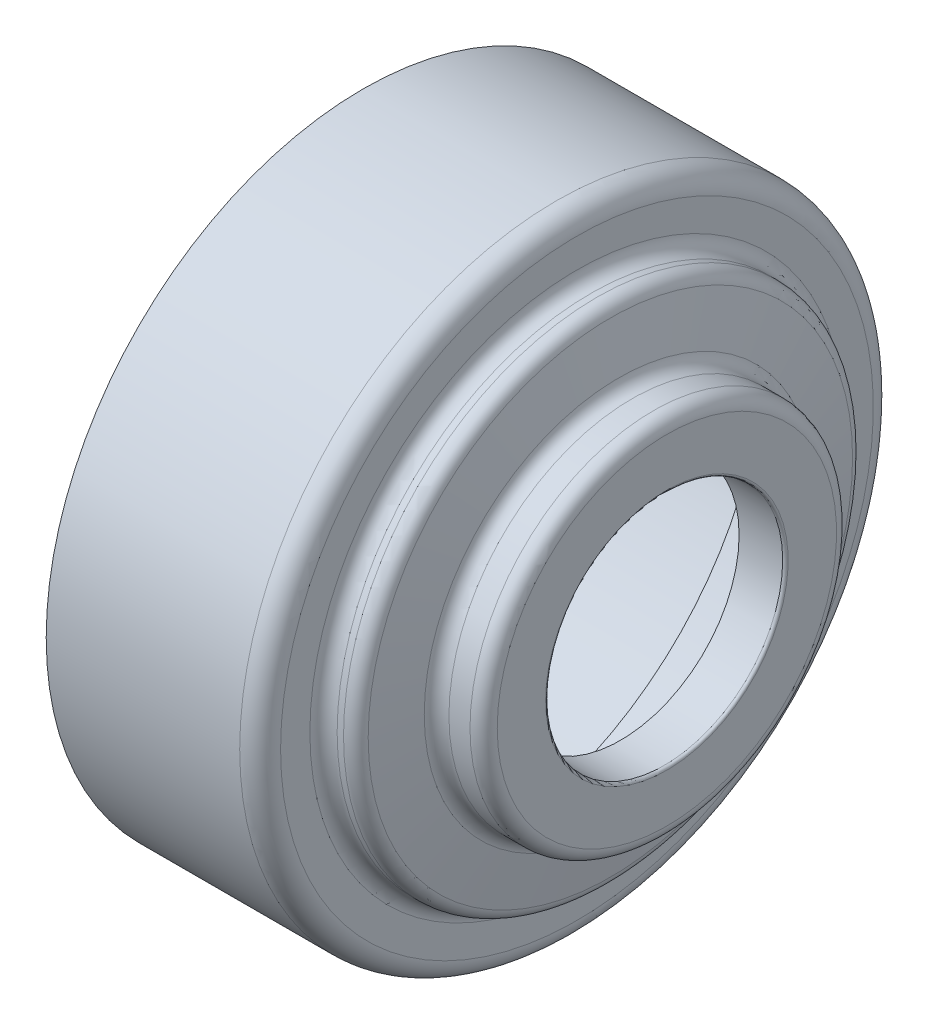
ISO-10303-21;
HEADER;
FILE_DESCRIPTION(('STEP AP214'),'2;1');
FILE_NAME('part.step','',(''),(''),'','','');
FILE_SCHEMA(('AUTOMOTIVE_DESIGN { 1 0 10303 214 1 1 1 1 }'));
ENDSEC;
DATA;
#1=APPLICATION_CONTEXT('core data for automotive mechanical design processes');
#2=APPLICATION_PROTOCOL_DEFINITION('international standard','automotive_design',2000,#1);
#3=PRODUCT_CONTEXT('',#1,'mechanical');
#4=PRODUCT('Part','Part','',(#3));
#5=PRODUCT_RELATED_PRODUCT_CATEGORY('part','',(#4));
#6=PRODUCT_DEFINITION_FORMATION('','',#4);
#7=PRODUCT_DEFINITION_CONTEXT('part definition',#1,'design');
#8=PRODUCT_DEFINITION('design','',#6,#7);
#9=PRODUCT_DEFINITION_SHAPE('','',#8);
#10=(LENGTH_UNIT() NAMED_UNIT(*) SI_UNIT(.MILLI.,.METRE.));
#11=(NAMED_UNIT(*) PLANE_ANGLE_UNIT() SI_UNIT($,.RADIAN.));
#12=(NAMED_UNIT(*) SI_UNIT($,.STERADIAN.) SOLID_ANGLE_UNIT());
#13=UNCERTAINTY_MEASURE_WITH_UNIT(LENGTH_MEASURE(1.E-05),#10,'distance_accuracy_value','');
#14=(GEOMETRIC_REPRESENTATION_CONTEXT(3) GLOBAL_UNCERTAINTY_ASSIGNED_CONTEXT((#13)) GLOBAL_UNIT_ASSIGNED_CONTEXT((#10,
#11,#12)) REPRESENTATION_CONTEXT('',''));
#15=CARTESIAN_POINT('',(0.,0.,0.));
#16=DIRECTION('',(0.,0.,1.));
#17=DIRECTION('',(1.,0.,0.));
#18=AXIS2_PLACEMENT_3D('',#15,#16,#17);
#19=CARTESIAN_POINT('',(-14.5,22.,0.));
#20=DIRECTION('',(1.,0.,0.));
#21=DIRECTION('',(0.,0.,-1.));
#22=AXIS2_PLACEMENT_3D('',#19,#20,#21);
#23=PLANE('',#22);
#24=CARTESIAN_POINT('',(-14.5,0.,0.));
#25=DIRECTION('',(-1.,0.,0.));
#26=DIRECTION('',(0.,0.,1.));
#27=AXIS2_PLACEMENT_3D('',#24,#25,#26);
#28=CIRCLE('',#27,22.);
#29=CARTESIAN_POINT('',(-14.5,0.,22.));
#30=VERTEX_POINT('',#29);
#31=EDGE_CURVE('E127',#30,#30,#28,.T.);
#32=ORIENTED_EDGE('',*,*,#31,.F.);
#33=EDGE_LOOP('',(#32));
#34=FACE_BOUND('',#33,.T.);
#35=CARTESIAN_POINT('',(-14.5,0.,0.));
#36=DIRECTION('',(-1.,0.,0.));
#37=DIRECTION('',(0.,0.,1.));
#38=AXIS2_PLACEMENT_3D('',#35,#36,#37);
#39=CIRCLE('',#38,23.25);
#40=CARTESIAN_POINT('',(-14.5,0.,23.25));
#41=VERTEX_POINT('',#40);
#42=EDGE_CURVE('E109',#41,#41,#39,.T.);
#43=ORIENTED_EDGE('',*,*,#42,.T.);
#44=EDGE_LOOP('',(#43));
#45=FACE_BOUND('',#44,.T.);
#46=ADVANCED_FACE('F35',(#34,#45),#23,.F.);
#47=CARTESIAN_POINT('',(-36.9366053169734,0.,0.));
#48=DIRECTION('',(-1.,0.,0.));
#49=DIRECTION('',(0.,0.,1.));
#50=AXIS2_PLACEMENT_3D('',#47,#48,#49);
#51=CYLINDRICAL_SURFACE('',#50,23.25);
#52=CARTESIAN_POINT('',(-0.300000000000002,0.,0.));
#53=DIRECTION('',(-1.,0.,0.));
#54=DIRECTION('',(0.,0.,1.));
#55=AXIS2_PLACEMENT_3D('',#52,#53,#54);
#56=CIRCLE('',#55,23.25);
#57=CARTESIAN_POINT('',(-0.300000000000002,0.,23.25));
#58=VERTEX_POINT('',#57);
#59=EDGE_CURVE('E50',#58,#58,#56,.T.);
#60=ORIENTED_EDGE('',*,*,#59,.T.);
#61=EDGE_LOOP('',(#60));
#62=FACE_BOUND('',#61,.T.);
#63=ORIENTED_EDGE('',*,*,#42,.F.);
#64=EDGE_LOOP('',(#63));
#65=FACE_BOUND('',#64,.T.);
#66=ADVANCED_FACE('F135',(#62,#65),#51,.T.);
#67=CARTESIAN_POINT('',(1.2,23.25,0.));
#68=DIRECTION('',(-1.,0.,0.));
#69=DIRECTION('',(0.,0.,1.));
#70=AXIS2_PLACEMENT_3D('',#67,#68,#69);
#71=PLANE('',#70);
#72=CARTESIAN_POINT('',(1.2,0.,0.));
#73=DIRECTION('',(-1.,0.,0.));
#74=DIRECTION('',(0.,0.,1.));
#75=AXIS2_PLACEMENT_3D('',#72,#73,#74);
#76=CIRCLE('',#75,21.75);
#77=CARTESIAN_POINT('',(1.2,0.,21.75));
#78=VERTEX_POINT('',#77);
#79=EDGE_CURVE('E46',#78,#78,#76,.F.);
#80=ORIENTED_EDGE('',*,*,#79,.T.);
#81=EDGE_LOOP('',(#80));
#82=FACE_BOUND('',#81,.T.);
#83=CARTESIAN_POINT('',(1.2,0.,0.));
#84=DIRECTION('',(-1.,0.,0.));
#85=DIRECTION('',(0.,0.,1.));
#86=AXIS2_PLACEMENT_3D('',#83,#84,#85);
#87=CIRCLE('',#86,19.6);
#88=CARTESIAN_POINT('',(1.2,0.,19.6));
#89=VERTEX_POINT('',#88);
#90=EDGE_CURVE('E67',#89,#89,#87,.T.);
#91=ORIENTED_EDGE('',*,*,#90,.T.);
#92=EDGE_LOOP('',(#91));
#93=FACE_BOUND('',#92,.T.);
#94=ADVANCED_FACE('F140',(#82,#93),#71,.F.);
#95=CARTESIAN_POINT('',(-36.9366053169734,0.,0.));
#96=DIRECTION('',(-1.,0.,0.));
#97=DIRECTION('',(0.,0.,1.));
#98=AXIS2_PLACEMENT_3D('',#95,#96,#97);
#99=CYLINDRICAL_SURFACE('',#98,18.6);
#100=CARTESIAN_POINT('',(2.2,0.,0.));
#101=DIRECTION('',(-1.,0.,0.));
#102=DIRECTION('',(0.,0.,1.));
#103=AXIS2_PLACEMENT_3D('',#100,#101,#102);
#104=CIRCLE('',#103,18.6);
#105=CARTESIAN_POINT('',(2.2,0.,18.6));
#106=VERTEX_POINT('',#105);
#107=EDGE_CURVE('E61',#106,#106,#104,.F.);
#108=ORIENTED_EDGE('',*,*,#107,.T.);
#109=EDGE_LOOP('',(#108));
#110=FACE_BOUND('',#109,.T.);
#111=CARTESIAN_POINT('',(2.66781992623546,0.,0.));
#112=DIRECTION('',(1.,0.,0.));
#113=DIRECTION('',(0.,0.,-1.));
#114=AXIS2_PLACEMENT_3D('',#111,#112,#113);
#115=CIRCLE('',#114,18.6);
#116=CARTESIAN_POINT('',(2.66781992623546,0.,-18.6));
#117=VERTEX_POINT('',#116);
#118=EDGE_CURVE('E64',#117,#117,#115,.F.);
#119=ORIENTED_EDGE('',*,*,#118,.T.);
#120=EDGE_LOOP('',(#119));
#121=FACE_BOUND('',#120,.T.);
#122=ADVANCED_FACE('F146',(#110,#121),#99,.T.);
#123=CARTESIAN_POINT('',(4.41500350806134,0.,0.));
#124=DIRECTION('',(-1.,0.,0.));
#125=DIRECTION('',(0.,0.,1.));
#126=AXIS2_PLACEMENT_3D('',#123,#124,#125);
#127=CONICAL_SURFACE('',#126,13.45,1.39626340159546);
#128=CARTESIAN_POINT('',(3.65262767924767,0.,0.));
#129=DIRECTION('',(1.,0.,0.));
#130=DIRECTION('',(0.,0.,-1.));
#131=AXIS2_PLACEMENT_3D('',#128,#129,#130);
#132=CIRCLE('',#131,17.7736481776669);
#133=CARTESIAN_POINT('',(3.65262767924767,0.,-17.7736481776669));
#134=VERTEX_POINT('',#133);
#135=EDGE_CURVE('E55',#134,#134,#132,.T.);
#136=ORIENTED_EDGE('',*,*,#135,.T.);
#137=EDGE_LOOP('',(#136));
#138=FACE_BOUND('',#137,.T.);
#139=CARTESIAN_POINT('',(4.26929538622642,0.,0.));
#140=DIRECTION('',(-1.,0.,0.));
#141=DIRECTION('',(0.,0.,1.));
#142=AXIS2_PLACEMENT_3D('',#139,#140,#141);
#143=CIRCLE('',#142,14.2763518223331);
#144=CARTESIAN_POINT('',(4.26929538622642,0.,14.2763518223331));
#145=VERTEX_POINT('',#144);
#146=EDGE_CURVE('E58',#145,#145,#143,.T.);
#147=ORIENTED_EDGE('',*,*,#146,.T.);
#148=EDGE_LOOP('',(#147));
#149=FACE_BOUND('',#148,.T.);
#150=ADVANCED_FACE('F291',(#138,#149),#127,.T.);
#151=CARTESIAN_POINT('',(-36.9366053169734,0.,0.));
#152=DIRECTION('',(-1.,0.,0.));
#153=DIRECTION('',(0.,0.,1.));
#154=AXIS2_PLACEMENT_3D('',#151,#152,#153);
#155=CYLINDRICAL_SURFACE('',#154,13.45);
#156=CARTESIAN_POINT('',(6.8,0.,0.));
#157=DIRECTION('',(-1.,0.,0.));
#158=DIRECTION('',(0.,0.,1.));
#159=AXIS2_PLACEMENT_3D('',#156,#157,#158);
#160=CIRCLE('',#159,13.45);
#161=CARTESIAN_POINT('',(6.8,0.,13.45));
#162=VERTEX_POINT('',#161);
#163=EDGE_CURVE('E73',#162,#162,#160,.T.);
#164=ORIENTED_EDGE('',*,*,#163,.T.);
#165=EDGE_LOOP('',(#164));
#166=FACE_BOUND('',#165,.T.);
#167=CARTESIAN_POINT('',(5.25410313923862,0.,0.));
#168=DIRECTION('',(-1.,0.,0.));
#169=DIRECTION('',(0.,0.,1.));
#170=AXIS2_PLACEMENT_3D('',#167,#168,#169);
#171=CIRCLE('',#170,13.45);
#172=CARTESIAN_POINT('',(5.25410313923862,0.,13.45));
#173=VERTEX_POINT('',#172);
#174=EDGE_CURVE('E76',#173,#173,#171,.F.);
#175=ORIENTED_EDGE('',*,*,#174,.T.);
#176=EDGE_LOOP('',(#175));
#177=FACE_BOUND('',#176,.T.);
#178=ADVANCED_FACE('F279',(#166,#177),#155,.T.);
#179=CARTESIAN_POINT('',(7.8,13.45,0.));
#180=DIRECTION('',(-1.,0.,0.));
#181=DIRECTION('',(0.,0.,1.));
#182=AXIS2_PLACEMENT_3D('',#179,#180,#181);
#183=PLANE('',#182);
#184=CARTESIAN_POINT('',(7.8,0.,0.));
#185=DIRECTION('',(-1.,0.,0.));
#186=DIRECTION('',(0.,0.,1.));
#187=AXIS2_PLACEMENT_3D('',#184,#185,#186);
#188=CIRCLE('',#187,12.45);
#189=CARTESIAN_POINT('',(7.8,0.,12.45));
#190=VERTEX_POINT('',#189);
#191=EDGE_CURVE('E70',#190,#190,#188,.F.);
#192=ORIENTED_EDGE('',*,*,#191,.T.);
#193=EDGE_LOOP('',(#192));
#194=FACE_BOUND('',#193,.T.);
#195=CARTESIAN_POINT('',(7.8,0.,0.));
#196=DIRECTION('',(-1.,0.,0.));
#197=DIRECTION('',(0.,0.,1.));
#198=AXIS2_PLACEMENT_3D('',#195,#196,#197);
#199=CIRCLE('',#198,8.9);
#200=CARTESIAN_POINT('',(7.8,0.,8.9));
#201=VERTEX_POINT('',#200);
#202=EDGE_CURVE('E100',#201,#201,#199,.T.);
#203=ORIENTED_EDGE('',*,*,#202,.T.);
#204=EDGE_LOOP('',(#203));
#205=FACE_BOUND('',#204,.T.);
#206=ADVANCED_FACE('F273',(#194,#205),#183,.F.);
#207=CARTESIAN_POINT('',(-36.9366053169734,0.,0.));
#208=DIRECTION('',(-1.,0.,0.));
#209=DIRECTION('',(0.,0.,1.));
#210=AXIS2_PLACEMENT_3D('',#207,#208,#209);
#211=CYLINDRICAL_SURFACE('',#210,8.7);
#212=CARTESIAN_POINT('',(7.6,0.,0.));
#213=DIRECTION('',(-1.,0.,0.));
#214=DIRECTION('',(0.,0.,1.));
#215=AXIS2_PLACEMENT_3D('',#212,#213,#214);
#216=CIRCLE('',#215,8.7);
#217=CARTESIAN_POINT('',(7.6,0.,8.7));
#218=VERTEX_POINT('',#217);
#219=EDGE_CURVE('E97',#218,#218,#216,.F.);
#220=ORIENTED_EDGE('',*,*,#219,.T.);
#221=EDGE_LOOP('',(#220));
#222=FACE_BOUND('',#221,.T.);
#223=CARTESIAN_POINT('',(4.4,0.,0.));
#224=DIRECTION('',(-1.,0.,0.));
#225=DIRECTION('',(0.,0.,1.));
#226=AXIS2_PLACEMENT_3D('',#223,#224,#225);
#227=CIRCLE('',#226,8.7);
#228=CARTESIAN_POINT('',(4.4,0.,8.7));
#229=VERTEX_POINT('',#228);
#230=EDGE_CURVE('E112',#229,#229,#227,.T.);
#231=ORIENTED_EDGE('',*,*,#230,.T.);
#232=EDGE_LOOP('',(#231));
#233=FACE_BOUND('',#232,.T.);
#234=ADVANCED_FACE('F278',(#222,#233),#211,.F.);
#235=CARTESIAN_POINT('',(4.4,9.4,0.));
#236=DIRECTION('',(1.,0.,0.));
#237=DIRECTION('',(0.,0.,-1.));
#238=AXIS2_PLACEMENT_3D('',#235,#236,#237);
#239=PLANE('',#238);
#240=ORIENTED_EDGE('',*,*,#230,.F.);
#241=EDGE_LOOP('',(#240));
#242=FACE_BOUND('',#241,.T.);
#243=CARTESIAN_POINT('',(4.4,0.,0.));
#244=DIRECTION('',(-1.,0.,0.));
#245=DIRECTION('',(0.,0.,1.));
#246=AXIS2_PLACEMENT_3D('',#243,#244,#245);
#247=CIRCLE('',#246,9.4);
#248=CARTESIAN_POINT('',(4.4,0.,9.4));
#249=VERTEX_POINT('',#248);
#250=EDGE_CURVE('E115',#249,#249,#247,.T.);
#251=ORIENTED_EDGE('',*,*,#250,.T.);
#252=EDGE_LOOP('',(#251));
#253=FACE_BOUND('',#252,.T.);
#254=ADVANCED_FACE('F385',(#242,#253),#239,.F.);
#255=CARTESIAN_POINT('',(-36.9366053169734,0.,0.));
#256=DIRECTION('',(-1.,0.,0.));
#257=DIRECTION('',(0.,0.,1.));
#258=AXIS2_PLACEMENT_3D('',#255,#256,#257);
#259=CYLINDRICAL_SURFACE('',#258,9.4);
#260=ORIENTED_EDGE('',*,*,#250,.F.);
#261=EDGE_LOOP('',(#260));
#262=FACE_BOUND('',#261,.T.);
#263=CARTESIAN_POINT('',(6.6,0.,0.));
#264=DIRECTION('',(-1.,0.,0.));
#265=DIRECTION('',(0.,0.,1.));
#266=AXIS2_PLACEMENT_3D('',#263,#264,#265);
#267=CIRCLE('',#266,9.4);
#268=CARTESIAN_POINT('',(6.6,0.,9.4));
#269=VERTEX_POINT('',#268);
#270=EDGE_CURVE('E118',#269,#269,#267,.T.);
#271=ORIENTED_EDGE('',*,*,#270,.T.);
#272=EDGE_LOOP('',(#271));
#273=FACE_BOUND('',#272,.T.);
#274=ADVANCED_FACE('F375',(#262,#273),#259,.T.);
#275=CARTESIAN_POINT('',(6.6,12.25,0.));
#276=DIRECTION('',(1.,0.,0.));
#277=DIRECTION('',(0.,0.,-1.));
#278=AXIS2_PLACEMENT_3D('',#275,#276,#277);
#279=PLANE('',#278);
#280=CARTESIAN_POINT('',(6.6,0.,0.));
#281=DIRECTION('',(1.,0.,0.));
#282=DIRECTION('',(0.,0.,-1.));
#283=AXIS2_PLACEMENT_3D('',#280,#281,#282);
#284=CIRCLE('',#283,12.05);
#285=CARTESIAN_POINT('',(6.6,0.,-12.05));
#286=VERTEX_POINT('',#285);
#287=EDGE_CURVE('E106',#286,#286,#284,.F.);
#288=ORIENTED_EDGE('',*,*,#287,.T.);
#289=EDGE_LOOP('',(#288));
#290=FACE_BOUND('',#289,.T.);
#291=ORIENTED_EDGE('',*,*,#270,.F.);
#292=EDGE_LOOP('',(#291));
#293=FACE_BOUND('',#292,.T.);
#294=ADVANCED_FACE('F229',(#290,#293),#279,.F.);
#295=CARTESIAN_POINT('',(-36.9366053169734,0.,0.));
#296=DIRECTION('',(-1.,0.,0.));
#297=DIRECTION('',(0.,0.,1.));
#298=AXIS2_PLACEMENT_3D('',#295,#296,#297);
#299=CYLINDRICAL_SURFACE('',#298,12.25);
#300=CARTESIAN_POINT('',(4.66673339741452,0.,0.));
#301=DIRECTION('',(1.,0.,0.));
#302=DIRECTION('',(0.,0.,-1.));
#303=AXIS2_PLACEMENT_3D('',#300,#301,#302);
#304=CIRCLE('',#303,12.25);
#305=CARTESIAN_POINT('',(4.66673339741452,0.,-12.25));
#306=VERTEX_POINT('',#305);
#307=EDGE_CURVE('E42',#306,#306,#304,.F.);
#308=ORIENTED_EDGE('',*,*,#307,.T.);
#309=EDGE_LOOP('',(#308));
#310=FACE_BOUND('',#309,.T.);
#311=CARTESIAN_POINT('',(6.4,0.,0.));
#312=DIRECTION('',(1.,0.,0.));
#313=DIRECTION('',(0.,0.,-1.));
#314=AXIS2_PLACEMENT_3D('',#311,#312,#313);
#315=CIRCLE('',#314,12.25);
#316=CARTESIAN_POINT('',(6.4,0.,-12.25));
#317=VERTEX_POINT('',#316);
#318=EDGE_CURVE('E103',#317,#317,#315,.T.);
#319=ORIENTED_EDGE('',*,*,#318,.T.);
#320=EDGE_LOOP('',(#319));
#321=FACE_BOUND('',#320,.T.);
#322=ADVANCED_FACE('F218',(#310,#321),#299,.F.);
#323=CARTESIAN_POINT('',(2.5,0.,0.));
#324=DIRECTION('',(-1.,0.,0.));
#325=DIRECTION('',(0.,0.,1.));
#326=AXIS2_PLACEMENT_3D('',#323,#324,#325);
#327=CONICAL_SURFACE('',#326,17.4,1.39626340159546);
#328=CARTESIAN_POINT('',(3.18952176789621,0.,0.));
#329=DIRECTION('',(1.,0.,0.));
#330=DIRECTION('',(0.,0.,-1.));
#331=AXIS2_PLACEMENT_3D('',#328,#329,#330);
#332=CIRCLE('',#331,13.4895277334996);
#333=CARTESIAN_POINT('',(3.18952176789621,0.,-13.4895277334996));
#334=VERTEX_POINT('',#333);
#335=EDGE_CURVE('E10',#334,#334,#332,.T.);
#336=ORIENTED_EDGE('',*,*,#335,.T.);
#337=EDGE_LOOP('',(#336));
#338=FACE_BOUND('',#337,.T.);
#339=CARTESIAN_POINT('',(2.529141624367,0.,0.));
#340=DIRECTION('',(-1.,0.,0.));
#341=DIRECTION('',(0.,0.,1.));
#342=AXIS2_PLACEMENT_3D('',#339,#340,#341);
#343=CIRCLE('',#342,17.2347296355334);
#344=CARTESIAN_POINT('',(2.529141624367,0.,17.2347296355334));
#345=VERTEX_POINT('',#344);
#346=EDGE_CURVE('E94',#345,#345,#343,.T.);
#347=ORIENTED_EDGE('',*,*,#346,.T.);
#348=EDGE_LOOP('',(#347));
#349=FACE_BOUND('',#348,.T.);
#350=ADVANCED_FACE('F212',(#338,#349),#327,.F.);
#351=CARTESIAN_POINT('',(-36.9366053169734,0.,0.));
#352=DIRECTION('',(-1.,0.,0.));
#353=DIRECTION('',(0.,0.,1.));
#354=AXIS2_PLACEMENT_3D('',#351,#352,#353);
#355=CYLINDRICAL_SURFACE('',#354,17.4);
#356=CARTESIAN_POINT('',(2.33218007376455,0.,0.));
#357=DIRECTION('',(-1.,0.,0.));
#358=DIRECTION('',(0.,0.,1.));
#359=AXIS2_PLACEMENT_3D('',#356,#357,#358);
#360=CIRCLE('',#359,17.4);
#361=CARTESIAN_POINT('',(2.33218007376455,0.,17.4));
#362=VERTEX_POINT('',#361);
#363=EDGE_CURVE('E88',#362,#362,#360,.F.);
#364=ORIENTED_EDGE('',*,*,#363,.T.);
#365=EDGE_LOOP('',(#364));
#366=FACE_BOUND('',#365,.T.);
#367=CARTESIAN_POINT('',(0.199999999999999,0.,0.));
#368=DIRECTION('',(1.,0.,0.));
#369=DIRECTION('',(0.,0.,-1.));
#370=AXIS2_PLACEMENT_3D('',#367,#368,#369);
#371=CIRCLE('',#370,17.4);
#372=CARTESIAN_POINT('',(0.199999999999999,0.,-17.4));
#373=VERTEX_POINT('',#372);
#374=EDGE_CURVE('E91',#373,#373,#371,.F.);
#375=ORIENTED_EDGE('',*,*,#374,.T.);
#376=EDGE_LOOP('',(#375));
#377=FACE_BOUND('',#376,.T.);
#378=ADVANCED_FACE('F217',(#366,#377),#355,.F.);
#379=CARTESIAN_POINT('',(0.,21.4,0.));
#380=DIRECTION('',(1.,0.,0.));
#381=DIRECTION('',(0.,0.,-1.));
#382=AXIS2_PLACEMENT_3D('',#379,#380,#381);
#383=PLANE('',#382);
#384=CARTESIAN_POINT('',(0.,0.,0.));
#385=DIRECTION('',(1.,0.,0.));
#386=DIRECTION('',(0.,0.,-1.));
#387=AXIS2_PLACEMENT_3D('',#384,#385,#386);
#388=CIRCLE('',#387,21.2);
#389=CARTESIAN_POINT('',(0.,0.,-21.2));
#390=VERTEX_POINT('',#389);
#391=EDGE_CURVE('E82',#390,#390,#388,.F.);
#392=ORIENTED_EDGE('',*,*,#391,.T.);
#393=EDGE_LOOP('',(#392));
#394=FACE_BOUND('',#393,.T.);
#395=CARTESIAN_POINT('',(0.,0.,0.));
#396=DIRECTION('',(1.,0.,0.));
#397=DIRECTION('',(0.,0.,-1.));
#398=AXIS2_PLACEMENT_3D('',#395,#396,#397);
#399=CIRCLE('',#398,17.6);
#400=CARTESIAN_POINT('',(0.,0.,-17.6));
#401=VERTEX_POINT('',#400);
#402=EDGE_CURVE('E85',#401,#401,#399,.T.);
#403=ORIENTED_EDGE('',*,*,#402,.T.);
#404=EDGE_LOOP('',(#403));
#405=FACE_BOUND('',#404,.T.);
#406=ADVANCED_FACE('F349',(#394,#405),#383,.F.);
#407=CARTESIAN_POINT('',(-36.9366053169734,0.,0.));
#408=DIRECTION('',(-1.,0.,0.));
#409=DIRECTION('',(0.,0.,1.));
#410=AXIS2_PLACEMENT_3D('',#407,#408,#409);
#411=CYLINDRICAL_SURFACE('',#410,21.4);
#412=CARTESIAN_POINT('',(-0.199999999999999,0.,0.));
#413=DIRECTION('',(1.,0.,0.));
#414=DIRECTION('',(0.,0.,-1.));
#415=AXIS2_PLACEMENT_3D('',#412,#413,#414);
#416=CIRCLE('',#415,21.4);
#417=CARTESIAN_POINT('',(-0.199999999999999,0.,-21.4));
#418=VERTEX_POINT('',#417);
#419=EDGE_CURVE('E79',#418,#418,#416,.T.);
#420=ORIENTED_EDGE('',*,*,#419,.T.);
#421=EDGE_LOOP('',(#420));
#422=FACE_BOUND('',#421,.T.);
#423=CARTESIAN_POINT('',(-6.49999999999999,0.,0.));
#424=DIRECTION('',(-1.,0.,0.));
#425=DIRECTION('',(0.,0.,1.));
#426=AXIS2_PLACEMENT_3D('',#423,#424,#425);
#427=CIRCLE('',#426,21.4);
#428=CARTESIAN_POINT('',(-6.49999999999999,0.,21.4));
#429=VERTEX_POINT('',#428);
#430=EDGE_CURVE('E121',#429,#429,#427,.T.);
#431=ORIENTED_EDGE('',*,*,#430,.T.);
#432=EDGE_LOOP('',(#431));
#433=FACE_BOUND('',#432,.T.);
#434=ADVANCED_FACE('F343',(#422,#433),#411,.F.);
#435=CARTESIAN_POINT('',(-6.49999999999999,22.,0.));
#436=DIRECTION('',(1.,0.,0.));
#437=DIRECTION('',(0.,0.,-1.));
#438=AXIS2_PLACEMENT_3D('',#435,#436,#437);
#439=PLANE('',#438);
#440=ORIENTED_EDGE('',*,*,#430,.F.);
#441=EDGE_LOOP('',(#440));
#442=FACE_BOUND('',#441,.T.);
#443=CARTESIAN_POINT('',(-6.49999999999999,0.,0.));
#444=DIRECTION('',(-1.,0.,0.));
#445=DIRECTION('',(0.,0.,1.));
#446=AXIS2_PLACEMENT_3D('',#443,#444,#445);
#447=CIRCLE('',#446,22.);
#448=CARTESIAN_POINT('',(-6.49999999999999,0.,22.));
#449=VERTEX_POINT('',#448);
#450=EDGE_CURVE('E124',#449,#449,#447,.T.);
#451=ORIENTED_EDGE('',*,*,#450,.T.);
#452=EDGE_LOOP('',(#451));
#453=FACE_BOUND('',#452,.T.);
#454=ADVANCED_FACE('F348',(#442,#453),#439,.F.);
#455=CARTESIAN_POINT('',(-36.9366053169734,0.,0.));
#456=DIRECTION('',(-1.,0.,0.));
#457=DIRECTION('',(0.,0.,1.));
#458=AXIS2_PLACEMENT_3D('',#455,#456,#457);
#459=CYLINDRICAL_SURFACE('',#458,22.);
#460=ORIENTED_EDGE('',*,*,#450,.F.);
#461=EDGE_LOOP('',(#460));
#462=FACE_BOUND('',#461,.T.);
#463=ORIENTED_EDGE('',*,*,#31,.T.);
#464=EDGE_LOOP('',(#463));
#465=FACE_BOUND('',#464,.T.);
#466=ADVANCED_FACE('F131',(#462,#465),#459,.F.);
#467=CARTESIAN_POINT('',(6.4,0.,0.));
#468=DIRECTION('',(1.,0.,0.));
#469=DIRECTION('',(0.,0.,-1.));
#470=AXIS2_PLACEMENT_3D('',#467,#468,#469);
#471=TOROIDAL_SURFACE('',#470,12.05,0.2);
#472=ORIENTED_EDGE('',*,*,#318,.F.);
#473=EDGE_LOOP('',(#472));
#474=FACE_BOUND('',#473,.T.);
#475=ORIENTED_EDGE('',*,*,#287,.F.);
#476=EDGE_LOOP('',(#475));
#477=FACE_BOUND('',#476,.T.);
#478=ADVANCED_FACE('F151',(#474,#477),#471,.F.);
#479=CARTESIAN_POINT('',(7.6,0.,0.));
#480=DIRECTION('',(-1.,0.,0.));
#481=DIRECTION('',(0.,0.,1.));
#482=AXIS2_PLACEMENT_3D('',#479,#480,#481);
#483=TOROIDAL_SURFACE('',#482,8.9,0.2);
#484=ORIENTED_EDGE('',*,*,#219,.F.);
#485=EDGE_LOOP('',(#484));
#486=FACE_BOUND('',#485,.T.);
#487=ORIENTED_EDGE('',*,*,#202,.F.);
#488=EDGE_LOOP('',(#487));
#489=FACE_BOUND('',#488,.T.);
#490=ADVANCED_FACE('F154',(#486,#489),#483,.T.);
#491=CARTESIAN_POINT('',(2.33218007376455,0.,0.));
#492=DIRECTION('',(-1.,0.,0.));
#493=DIRECTION('',(0.,0.,1.));
#494=AXIS2_PLACEMENT_3D('',#491,#492,#493);
#495=TOROIDAL_SURFACE('',#494,17.2,0.2);
#496=ORIENTED_EDGE('',*,*,#363,.F.);
#497=EDGE_LOOP('',(#496));
#498=FACE_BOUND('',#497,.T.);
#499=ORIENTED_EDGE('',*,*,#346,.F.);
#500=EDGE_LOOP('',(#499));
#501=FACE_BOUND('',#500,.T.);
#502=ADVANCED_FACE('F158',(#498,#501),#495,.F.);
#503=CARTESIAN_POINT('',(-0.199999999999999,0.,0.));
#504=DIRECTION('',(1.,0.,0.));
#505=DIRECTION('',(0.,0.,-1.));
#506=AXIS2_PLACEMENT_3D('',#503,#504,#505);
#507=TOROIDAL_SURFACE('',#506,21.2,0.2);
#508=ORIENTED_EDGE('',*,*,#419,.F.);
#509=EDGE_LOOP('',(#508));
#510=FACE_BOUND('',#509,.T.);
#511=ORIENTED_EDGE('',*,*,#391,.F.);
#512=EDGE_LOOP('',(#511));
#513=FACE_BOUND('',#512,.T.);
#514=ADVANCED_FACE('F162',(#510,#513),#507,.F.);
#515=CARTESIAN_POINT('',(0.199999999999999,0.,0.));
#516=DIRECTION('',(1.,0.,0.));
#517=DIRECTION('',(0.,0.,-1.));
#518=AXIS2_PLACEMENT_3D('',#515,#516,#517);
#519=TOROIDAL_SURFACE('',#518,17.6,0.2);
#520=ORIENTED_EDGE('',*,*,#402,.F.);
#521=EDGE_LOOP('',(#520));
#522=FACE_BOUND('',#521,.T.);
#523=ORIENTED_EDGE('',*,*,#374,.F.);
#524=EDGE_LOOP('',(#523));
#525=FACE_BOUND('',#524,.T.);
#526=ADVANCED_FACE('F166',(#522,#525),#519,.T.);
#527=CARTESIAN_POINT('',(6.8,0.,0.));
#528=DIRECTION('',(-1.,0.,0.));
#529=DIRECTION('',(0.,0.,1.));
#530=AXIS2_PLACEMENT_3D('',#527,#528,#529);
#531=TOROIDAL_SURFACE('',#530,12.45,1.);
#532=ORIENTED_EDGE('',*,*,#191,.F.);
#533=EDGE_LOOP('',(#532));
#534=FACE_BOUND('',#533,.T.);
#535=ORIENTED_EDGE('',*,*,#163,.F.);
#536=EDGE_LOOP('',(#535));
#537=FACE_BOUND('',#536,.T.);
#538=ADVANCED_FACE('F170',(#534,#537),#531,.T.);
#539=CARTESIAN_POINT('',(2.2,0.,0.));
#540=DIRECTION('',(-1.,0.,0.));
#541=DIRECTION('',(0.,0.,1.));
#542=AXIS2_PLACEMENT_3D('',#539,#540,#541);
#543=TOROIDAL_SURFACE('',#542,19.6,1.);
#544=ORIENTED_EDGE('',*,*,#107,.F.);
#545=EDGE_LOOP('',(#544));
#546=FACE_BOUND('',#545,.T.);
#547=ORIENTED_EDGE('',*,*,#90,.F.);
#548=EDGE_LOOP('',(#547));
#549=FACE_BOUND('',#548,.T.);
#550=ADVANCED_FACE('F174',(#546,#549),#543,.F.);
#551=CARTESIAN_POINT('',(2.66781992623546,0.,0.));
#552=DIRECTION('',(1.,0.,0.));
#553=DIRECTION('',(0.,0.,-1.));
#554=AXIS2_PLACEMENT_3D('',#551,#552,#553);
#555=TOROIDAL_SURFACE('',#554,17.6,1.);
#556=ORIENTED_EDGE('',*,*,#135,.F.);
#557=EDGE_LOOP('',(#556));
#558=FACE_BOUND('',#557,.T.);
#559=ORIENTED_EDGE('',*,*,#118,.F.);
#560=EDGE_LOOP('',(#559));
#561=FACE_BOUND('',#560,.T.);
#562=ADVANCED_FACE('F178',(#558,#561),#555,.T.);
#563=CARTESIAN_POINT('',(5.25410313923862,0.,0.));
#564=DIRECTION('',(-1.,0.,0.));
#565=DIRECTION('',(0.,0.,1.));
#566=AXIS2_PLACEMENT_3D('',#563,#564,#565);
#567=TOROIDAL_SURFACE('',#566,14.45,1.);
#568=ORIENTED_EDGE('',*,*,#174,.F.);
#569=EDGE_LOOP('',(#568));
#570=FACE_BOUND('',#569,.T.);
#571=ORIENTED_EDGE('',*,*,#146,.F.);
#572=EDGE_LOOP('',(#571));
#573=FACE_BOUND('',#572,.T.);
#574=ADVANCED_FACE('F182',(#570,#573),#567,.F.);
#575=CARTESIAN_POINT('',(-0.300000000000002,0.,0.));
#576=DIRECTION('',(-1.,0.,0.));
#577=DIRECTION('',(0.,0.,1.));
#578=AXIS2_PLACEMENT_3D('',#575,#576,#577);
#579=TOROIDAL_SURFACE('',#578,21.75,1.5);
#580=ORIENTED_EDGE('',*,*,#79,.F.);
#581=EDGE_LOOP('',(#580));
#582=FACE_BOUND('',#581,.T.);
#583=ORIENTED_EDGE('',*,*,#59,.F.);
#584=EDGE_LOOP('',(#583));
#585=FACE_BOUND('',#584,.T.);
#586=ADVANCED_FACE('F185',(#582,#585),#579,.T.);
#587=CARTESIAN_POINT('',(4.66673339741452,0.,0.));
#588=DIRECTION('',(1.,0.,0.));
#589=DIRECTION('',(0.,0.,-1.));
#590=AXIS2_PLACEMENT_3D('',#587,#588,#589);
#591=TOROIDAL_SURFACE('',#590,13.75,1.5);
#592=ORIENTED_EDGE('',*,*,#335,.F.);
#593=EDGE_LOOP('',(#592));
#594=FACE_BOUND('',#593,.T.);
#595=ORIENTED_EDGE('',*,*,#307,.F.);
#596=EDGE_LOOP('',(#595));
#597=FACE_BOUND('',#596,.T.);
#598=ADVANCED_FACE('F37',(#594,#597),#591,.T.);
#599=CLOSED_SHELL('',(#46,#66,#94,#122,#150,#178,#206,#234,#254,#274,#294,#322,#350,#378,#406,
#434,#454,#466,#478,#490,#502,#514,#526,#538,#550,#562,#574,#586,#598));
#600=MANIFOLD_SOLID_BREP('B2',#599);
#601=ADVANCED_BREP_SHAPE_REPRESENTATION('',(#18,#600),#14);
#602=SHAPE_DEFINITION_REPRESENTATION(#9,#601);
ENDSEC;
END-ISO-10303-21;
